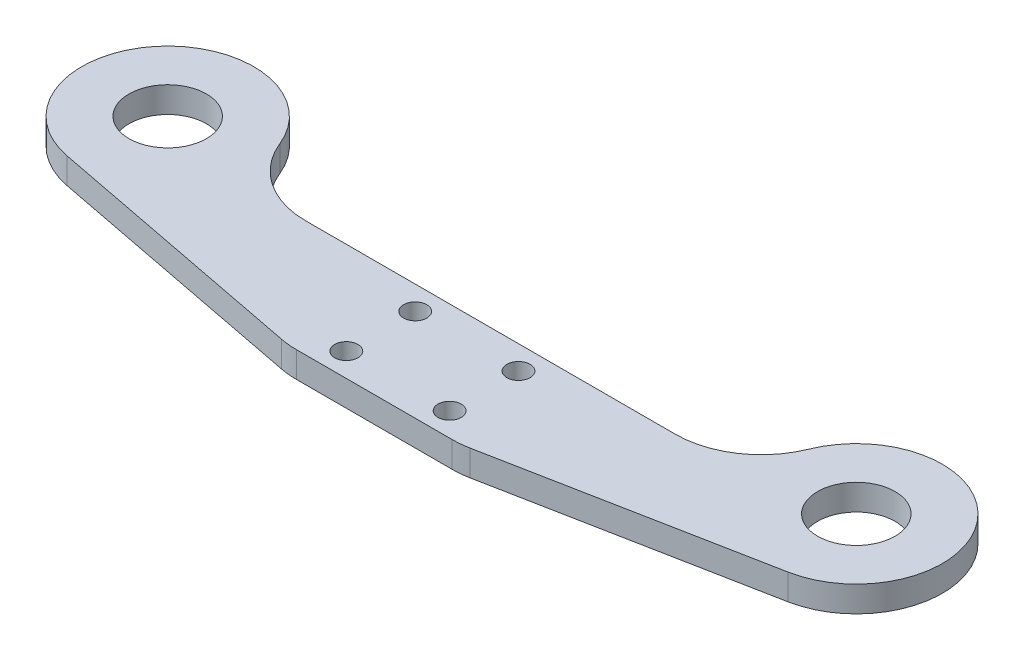
ISO-10303-21;
HEADER;
FILE_DESCRIPTION(('STEP AP214'),'2;1');
FILE_NAME('part.step','',(''),(''),'','','');
FILE_SCHEMA(('AUTOMOTIVE_DESIGN { 1 0 10303 214 1 1 1 1 }'));
ENDSEC;
DATA;
#1=APPLICATION_CONTEXT('core data for automotive mechanical design processes');
#2=APPLICATION_PROTOCOL_DEFINITION('international standard','automotive_design',2000,#1);
#3=PRODUCT_CONTEXT('',#1,'mechanical');
#4=PRODUCT('Part','Part','',(#3));
#5=PRODUCT_RELATED_PRODUCT_CATEGORY('part','',(#4));
#6=PRODUCT_DEFINITION_FORMATION('','',#4);
#7=PRODUCT_DEFINITION_CONTEXT('part definition',#1,'design');
#8=PRODUCT_DEFINITION('design','',#6,#7);
#9=PRODUCT_DEFINITION_SHAPE('','',#8);
#10=(LENGTH_UNIT() NAMED_UNIT(*) SI_UNIT(.MILLI.,.METRE.));
#11=(NAMED_UNIT(*) PLANE_ANGLE_UNIT() SI_UNIT($,.RADIAN.));
#12=(NAMED_UNIT(*) SI_UNIT($,.STERADIAN.) SOLID_ANGLE_UNIT());
#13=UNCERTAINTY_MEASURE_WITH_UNIT(LENGTH_MEASURE(1.E-05),#10,'distance_accuracy_value','');
#14=(GEOMETRIC_REPRESENTATION_CONTEXT(3) GLOBAL_UNCERTAINTY_ASSIGNED_CONTEXT((#13)) GLOBAL_UNIT_ASSIGNED_CONTEXT((#10,
#11,#12)) REPRESENTATION_CONTEXT('',''));
#15=CARTESIAN_POINT('',(0.,0.,0.));
#16=DIRECTION('',(0.,0.,1.));
#17=DIRECTION('',(1.,0.,0.));
#18=AXIS2_PLACEMENT_3D('',#15,#16,#17);
#19=CARTESIAN_POINT('',(-6.,3.,-4.));
#20=DIRECTION('',(0.,-1.,0.));
#21=DIRECTION('',(0.,0.,-1.));
#22=AXIS2_PLACEMENT_3D('',#19,#20,#21);
#23=CYLINDRICAL_SURFACE('',#22,1.35);
#24=CARTESIAN_POINT('',(-6.,3.,-4.));
#25=DIRECTION('',(0.,1.,0.));
#26=DIRECTION('',(0.,0.,1.));
#27=AXIS2_PLACEMENT_3D('',#24,#25,#26);
#28=CIRCLE('',#27,1.35);
#29=CARTESIAN_POINT('',(-6.,3.,-2.65));
#30=VERTEX_POINT('',#29);
#31=EDGE_CURVE('E192',#30,#30,#28,.T.);
#32=ORIENTED_EDGE('',*,*,#31,.T.);
#33=EDGE_LOOP('',(#32));
#34=FACE_BOUND('',#33,.T.);
#35=CARTESIAN_POINT('',(-6.,0.,-4.));
#36=DIRECTION('',(0.,1.,0.));
#37=DIRECTION('',(0.,0.,1.));
#38=AXIS2_PLACEMENT_3D('',#35,#36,#37);
#39=CIRCLE('',#38,1.35);
#40=CARTESIAN_POINT('',(-6.,0.,-2.65));
#41=VERTEX_POINT('',#40);
#42=EDGE_CURVE('E269',#41,#41,#39,.T.);
#43=ORIENTED_EDGE('',*,*,#42,.F.);
#44=EDGE_LOOP('',(#43));
#45=FACE_BOUND('',#44,.T.);
#46=ADVANCED_FACE('F84',(#34,#45),#23,.F.);
#47=CARTESIAN_POINT('',(-6.,3.,4.));
#48=DIRECTION('',(0.,-1.,0.));
#49=DIRECTION('',(0.,0.,-1.));
#50=AXIS2_PLACEMENT_3D('',#47,#48,#49);
#51=CYLINDRICAL_SURFACE('',#50,1.35);
#52=CARTESIAN_POINT('',(-6.,3.,4.));
#53=DIRECTION('',(0.,1.,0.));
#54=DIRECTION('',(0.,0.,1.));
#55=AXIS2_PLACEMENT_3D('',#52,#53,#54);
#56=CIRCLE('',#55,1.35);
#57=CARTESIAN_POINT('',(-6.,3.,5.35));
#58=VERTEX_POINT('',#57);
#59=EDGE_CURVE('E287',#58,#58,#56,.T.);
#60=ORIENTED_EDGE('',*,*,#59,.T.);
#61=EDGE_LOOP('',(#60));
#62=FACE_BOUND('',#61,.T.);
#63=CARTESIAN_POINT('',(-6.,0.,4.));
#64=DIRECTION('',(0.,1.,0.));
#65=DIRECTION('',(0.,0.,1.));
#66=AXIS2_PLACEMENT_3D('',#63,#64,#65);
#67=CIRCLE('',#66,1.35);
#68=CARTESIAN_POINT('',(-6.,0.,5.35));
#69=VERTEX_POINT('',#68);
#70=EDGE_CURVE('E267',#69,#69,#67,.T.);
#71=ORIENTED_EDGE('',*,*,#70,.F.);
#72=EDGE_LOOP('',(#71));
#73=FACE_BOUND('',#72,.T.);
#74=ADVANCED_FACE('F307',(#62,#73),#51,.F.);
#75=CARTESIAN_POINT('',(6.,3.,4.));
#76=DIRECTION('',(0.,-1.,0.));
#77=DIRECTION('',(0.,0.,-1.));
#78=AXIS2_PLACEMENT_3D('',#75,#76,#77);
#79=CYLINDRICAL_SURFACE('',#78,1.35);
#80=CARTESIAN_POINT('',(6.,3.,4.));
#81=DIRECTION('',(0.,1.,0.));
#82=DIRECTION('',(0.,0.,1.));
#83=AXIS2_PLACEMENT_3D('',#80,#81,#82);
#84=CIRCLE('',#83,1.35);
#85=CARTESIAN_POINT('',(6.,3.,5.35));
#86=VERTEX_POINT('',#85);
#87=EDGE_CURVE('E284',#86,#86,#84,.T.);
#88=ORIENTED_EDGE('',*,*,#87,.T.);
#89=EDGE_LOOP('',(#88));
#90=FACE_BOUND('',#89,.T.);
#91=CARTESIAN_POINT('',(6.,0.,4.));
#92=DIRECTION('',(0.,1.,0.));
#93=DIRECTION('',(0.,0.,1.));
#94=AXIS2_PLACEMENT_3D('',#91,#92,#93);
#95=CIRCLE('',#94,1.35);
#96=CARTESIAN_POINT('',(6.,0.,5.35));
#97=VERTEX_POINT('',#96);
#98=EDGE_CURVE('E264',#97,#97,#95,.T.);
#99=ORIENTED_EDGE('',*,*,#98,.F.);
#100=EDGE_LOOP('',(#99));
#101=FACE_BOUND('',#100,.T.);
#102=ADVANCED_FACE('F313',(#90,#101),#79,.F.);
#103=CARTESIAN_POINT('',(6.,3.,-4.));
#104=DIRECTION('',(0.,-1.,0.));
#105=DIRECTION('',(0.,0.,-1.));
#106=AXIS2_PLACEMENT_3D('',#103,#104,#105);
#107=CYLINDRICAL_SURFACE('',#106,1.35);
#108=CARTESIAN_POINT('',(6.,3.,-4.));
#109=DIRECTION('',(0.,1.,0.));
#110=DIRECTION('',(0.,0.,1.));
#111=AXIS2_PLACEMENT_3D('',#108,#109,#110);
#112=CIRCLE('',#111,1.35);
#113=CARTESIAN_POINT('',(6.,3.,-2.65));
#114=VERTEX_POINT('',#113);
#115=EDGE_CURVE('E281',#114,#114,#112,.T.);
#116=ORIENTED_EDGE('',*,*,#115,.T.);
#117=EDGE_LOOP('',(#116));
#118=FACE_BOUND('',#117,.T.);
#119=CARTESIAN_POINT('',(6.,0.,-4.));
#120=DIRECTION('',(0.,1.,0.));
#121=DIRECTION('',(0.,0.,1.));
#122=AXIS2_PLACEMENT_3D('',#119,#120,#121);
#123=CIRCLE('',#122,1.35);
#124=CARTESIAN_POINT('',(6.,0.,-2.65));
#125=VERTEX_POINT('',#124);
#126=EDGE_CURVE('E261',#125,#125,#123,.T.);
#127=ORIENTED_EDGE('',*,*,#126,.F.);
#128=EDGE_LOOP('',(#127));
#129=FACE_BOUND('',#128,.T.);
#130=ADVANCED_FACE('F322',(#118,#129),#107,.F.);
#131=CARTESIAN_POINT('',(40.,3.,-9.25000000000001));
#132=DIRECTION('',(0.,-1.,0.));
#133=DIRECTION('',(0.,0.,-1.));
#134=AXIS2_PLACEMENT_3D('',#131,#132,#133);
#135=CYLINDRICAL_SURFACE('',#134,4.5);
#136=CARTESIAN_POINT('',(40.,3.,-9.25000000000001));
#137=DIRECTION('',(0.,1.,0.));
#138=DIRECTION('',(0.,0.,1.));
#139=AXIS2_PLACEMENT_3D('',#136,#137,#138);
#140=CIRCLE('',#139,4.5);
#141=CARTESIAN_POINT('',(40.,3.,-4.75000000000001));
#142=VERTEX_POINT('',#141);
#143=EDGE_CURVE('E239',#142,#142,#140,.F.);
#144=ORIENTED_EDGE('',*,*,#143,.F.);
#145=EDGE_LOOP('',(#144));
#146=FACE_BOUND('',#145,.T.);
#147=CARTESIAN_POINT('',(40.,0.,-9.25000000000001));
#148=DIRECTION('',(0.,1.,0.));
#149=DIRECTION('',(0.,0.,1.));
#150=AXIS2_PLACEMENT_3D('',#147,#148,#149);
#151=CIRCLE('',#150,4.5);
#152=CARTESIAN_POINT('',(40.,0.,-4.75000000000001));
#153=VERTEX_POINT('',#152);
#154=EDGE_CURVE('E253',#153,#153,#151,.F.);
#155=ORIENTED_EDGE('',*,*,#154,.T.);
#156=EDGE_LOOP('',(#155));
#157=FACE_BOUND('',#156,.T.);
#158=ADVANCED_FACE('F326',(#146,#157),#135,.F.);
#159=CARTESIAN_POINT('',(0.,3.,-6.75));
#160=DIRECTION('',(0.,0.,1.));
#161=DIRECTION('',(1.,0.,0.));
#162=AXIS2_PLACEMENT_3D('',#159,#160,#161);
#163=PLANE('',#162);
#164=DIRECTION('',(-1.,0.,0.));
#165=VECTOR('',#164,1.);
#166=CARTESIAN_POINT('',(0.,3.,-6.75));
#167=LINE('',#166,#165);
#168=CARTESIAN_POINT('',(21.4595037822608,3.,-6.75));
#169=VERTEX_POINT('',#168);
#170=CARTESIAN_POINT('',(-21.4595037822608,3.,-6.75));
#171=VERTEX_POINT('',#170);
#172=EDGE_CURVE('E168',#169,#171,#167,.T.);
#173=ORIENTED_EDGE('',*,*,#172,.F.);
#174=DIRECTION('',(0.,-1.,0.));
#175=VECTOR('',#174,1.);
#176=CARTESIAN_POINT('',(21.4595037822608,3.,-6.75));
#177=LINE('',#176,#175);
#178=CARTESIAN_POINT('',(21.4595037822608,0.,-6.75));
#179=VERTEX_POINT('',#178);
#180=EDGE_CURVE('E189',#169,#179,#177,.T.);
#181=ORIENTED_EDGE('',*,*,#180,.T.);
#182=DIRECTION('',(-1.,0.,0.));
#183=VECTOR('',#182,1.);
#184=CARTESIAN_POINT('',(0.,0.,-6.75));
#185=LINE('',#184,#183);
#186=CARTESIAN_POINT('',(-21.4595037822608,0.,-6.75));
#187=VERTEX_POINT('',#186);
#188=EDGE_CURVE('E255',#179,#187,#185,.T.);
#189=ORIENTED_EDGE('',*,*,#188,.T.);
#190=DIRECTION('',(0.,1.,0.));
#191=VECTOR('',#190,1.);
#192=CARTESIAN_POINT('',(-21.4595037822608,3.,-6.75));
#193=LINE('',#192,#191);
#194=EDGE_CURVE('E186',#187,#171,#193,.T.);
#195=ORIENTED_EDGE('',*,*,#194,.T.);
#196=EDGE_LOOP('',(#173,#181,#189,#195));
#197=FACE_BOUND('',#196,.T.);
#198=ADVANCED_FACE('F297',(#197),#163,.F.);
#199=CARTESIAN_POINT('',(-1.62276662068648,3.,8.37349174268104));
#200=DIRECTION('',(-0.190258181571541,0.,0.98173409044664));
#201=DIRECTION('',(0.98173409044664,0.,0.190258181571541));
#202=AXIS2_PLACEMENT_3D('',#199,#200,#201);
#203=PLANE('',#202);
#204=DIRECTION('',(-0.98173409044664,0.,-0.190258181571541));
#205=VECTOR('',#204,1.);
#206=CARTESIAN_POINT('',(-1.62276662068648,0.,8.37349174268104));
#207=LINE('',#206,#205);
#208=CARTESIAN_POINT('',(-10.9425227316601,0.,6.56734090446639));
#209=VERTEX_POINT('',#208);
#210=CARTESIAN_POINT('',(-41.9025818157154,0.,0.567340904466406));
#211=VERTEX_POINT('',#210);
#212=EDGE_CURVE('E251',#209,#211,#207,.T.);
#213=ORIENTED_EDGE('',*,*,#212,.F.);
#214=DIRECTION('',(0.,-1.,0.));
#215=VECTOR('',#214,1.);
#216=CARTESIAN_POINT('',(-10.9425227316601,3.,6.5673409044664));
#217=LINE('',#216,#215);
#218=CARTESIAN_POINT('',(-10.9425227316601,3.,6.56734090446639));
#219=VERTEX_POINT('',#218);
#220=EDGE_CURVE('E12',#209,#219,#217,.F.);
#221=ORIENTED_EDGE('',*,*,#220,.T.);
#222=DIRECTION('',(-0.98173409044664,0.,-0.190258181571541));
#223=VECTOR('',#222,1.);
#224=CARTESIAN_POINT('',(-1.62276662068648,3.,8.37349174268104));
#225=LINE('',#224,#223);
#226=CARTESIAN_POINT('',(-41.9025818157154,3.,0.567340904466406));
#227=VERTEX_POINT('',#226);
#228=EDGE_CURVE('E160',#219,#227,#225,.T.);
#229=ORIENTED_EDGE('',*,*,#228,.T.);
#230=DIRECTION('',(0.,-1.,0.));
#231=VECTOR('',#230,1.);
#232=CARTESIAN_POINT('',(-41.9025818157154,3.,0.567340904466406));
#233=LINE('',#232,#231);
#234=EDGE_CURVE('E164',#227,#211,#233,.T.);
#235=ORIENTED_EDGE('',*,*,#234,.T.);
#236=EDGE_LOOP('',(#213,#221,#229,#235));
#237=FACE_BOUND('',#236,.T.);
#238=ADVANCED_FACE('F162',(#237),#203,.T.);
#239=CARTESIAN_POINT('',(0.,3.,6.75));
#240=DIRECTION('',(0.,0.,-1.));
#241=DIRECTION('',(-1.,0.,0.));
#242=AXIS2_PLACEMENT_3D('',#239,#240,#241);
#243=PLANE('',#242);
#244=DIRECTION('',(1.,0.,0.));
#245=VECTOR('',#244,1.);
#246=CARTESIAN_POINT('',(0.,0.,6.75));
#247=LINE('',#246,#245);
#248=CARTESIAN_POINT('',(-9.03994091594468,0.,6.75));
#249=VERTEX_POINT('',#248);
#250=CARTESIAN_POINT('',(9.03994091594468,0.,6.75));
#251=VERTEX_POINT('',#250);
#252=EDGE_CURVE('E246',#249,#251,#247,.T.);
#253=ORIENTED_EDGE('',*,*,#252,.T.);
#254=DIRECTION('',(0.,-1.,0.));
#255=VECTOR('',#254,1.);
#256=CARTESIAN_POINT('',(9.03994091594468,3.,6.75));
#257=LINE('',#256,#255);
#258=CARTESIAN_POINT('',(9.03994091594468,3.,6.75));
#259=VERTEX_POINT('',#258);
#260=EDGE_CURVE('E105',#251,#259,#257,.F.);
#261=ORIENTED_EDGE('',*,*,#260,.T.);
#262=DIRECTION('',(1.,0.,0.));
#263=VECTOR('',#262,1.);
#264=CARTESIAN_POINT('',(0.,3.,6.75));
#265=LINE('',#264,#263);
#266=CARTESIAN_POINT('',(-9.03994091594468,3.,6.75));
#267=VERTEX_POINT('',#266);
#268=EDGE_CURVE('E167',#267,#259,#265,.T.);
#269=ORIENTED_EDGE('',*,*,#268,.F.);
#270=DIRECTION('',(0.,-1.,0.));
#271=VECTOR('',#270,1.);
#272=CARTESIAN_POINT('',(-9.03994091594468,0.,6.75));
#273=LINE('',#272,#271);
#274=EDGE_CURVE('E223',#267,#249,#273,.T.);
#275=ORIENTED_EDGE('',*,*,#274,.T.);
#276=EDGE_LOOP('',(#253,#261,#269,#275));
#277=FACE_BOUND('',#276,.T.);
#278=ADVANCED_FACE('F249',(#277),#243,.F.);
#279=CARTESIAN_POINT('',(1.62276662068648,3.,8.37349174268104));
#280=DIRECTION('',(-0.190258181571541,0.,-0.98173409044664));
#281=DIRECTION('',(-0.98173409044664,0.,0.190258181571541));
#282=AXIS2_PLACEMENT_3D('',#279,#280,#281);
#283=PLANE('',#282);
#284=DIRECTION('',(0.98173409044664,0.,-0.190258181571541));
#285=VECTOR('',#284,1.);
#286=CARTESIAN_POINT('',(1.62276662068648,3.,8.37349174268104));
#287=LINE('',#286,#285);
#288=CARTESIAN_POINT('',(10.9425227316601,3.,6.56734090446639));
#289=VERTEX_POINT('',#288);
#290=CARTESIAN_POINT('',(41.9025818157154,3.,0.567340904466411));
#291=VERTEX_POINT('',#290);
#292=EDGE_CURVE('E231',#289,#291,#287,.T.);
#293=ORIENTED_EDGE('',*,*,#292,.F.);
#294=DIRECTION('',(0.,-1.,0.));
#295=VECTOR('',#294,1.);
#296=CARTESIAN_POINT('',(10.9425227316601,3.,6.5673409044664));
#297=LINE('',#296,#295);
#298=CARTESIAN_POINT('',(10.9425227316601,0.,6.56734090446639));
#299=VERTEX_POINT('',#298);
#300=EDGE_CURVE('E216',#289,#299,#297,.T.);
#301=ORIENTED_EDGE('',*,*,#300,.T.);
#302=DIRECTION('',(0.98173409044664,0.,-0.190258181571541));
#303=VECTOR('',#302,1.);
#304=CARTESIAN_POINT('',(1.62276662068648,0.,8.37349174268104));
#305=LINE('',#304,#303);
#306=CARTESIAN_POINT('',(41.9025818157154,0.,0.567340904466411));
#307=VERTEX_POINT('',#306);
#308=EDGE_CURVE('E248',#299,#307,#305,.T.);
#309=ORIENTED_EDGE('',*,*,#308,.T.);
#310=DIRECTION('',(0.,-1.,0.));
#311=VECTOR('',#310,1.);
#312=CARTESIAN_POINT('',(41.9025818157154,3.,0.567340904466411));
#313=LINE('',#312,#311);
#314=EDGE_CURVE('E187',#291,#307,#313,.T.);
#315=ORIENTED_EDGE('',*,*,#314,.F.);
#316=EDGE_LOOP('',(#293,#301,#309,#315));
#317=FACE_BOUND('',#316,.T.);
#318=ADVANCED_FACE('F237',(#317),#283,.F.);
#319=CARTESIAN_POINT('',(40.,3.,-9.25000000000001));
#320=DIRECTION('',(0.,-1.,0.));
#321=DIRECTION('',(0.,0.,-1.));
#322=AXIS2_PLACEMENT_3D('',#319,#320,#321);
#323=CYLINDRICAL_SURFACE('',#322,10.);
#324=CARTESIAN_POINT('',(40.,0.,-9.25000000000001));
#325=DIRECTION('',(0.,1.,0.));
#326=DIRECTION('',(0.,0.,1.));
#327=AXIS2_PLACEMENT_3D('',#324,#325,#326);
#328=CIRCLE('',#327,10.);
#329=CARTESIAN_POINT('',(30.7297518911304,0.,-13.));
#330=VERTEX_POINT('',#329);
#331=EDGE_CURVE('E180',#330,#307,#328,.F.);
#332=ORIENTED_EDGE('',*,*,#331,.F.);
#333=DIRECTION('',(0.,-1.,0.));
#334=VECTOR('',#333,1.);
#335=CARTESIAN_POINT('',(30.7297518911304,3.,-13.));
#336=LINE('',#335,#334);
#337=CARTESIAN_POINT('',(30.7297518911304,3.,-13.));
#338=VERTEX_POINT('',#337);
#339=EDGE_CURVE('E205',#330,#338,#336,.F.);
#340=ORIENTED_EDGE('',*,*,#339,.T.);
#341=CARTESIAN_POINT('',(40.,3.,-9.25000000000001));
#342=DIRECTION('',(0.,1.,0.));
#343=DIRECTION('',(0.,0.,1.));
#344=AXIS2_PLACEMENT_3D('',#341,#342,#343);
#345=CIRCLE('',#344,10.);
#346=EDGE_CURVE('E271',#338,#291,#345,.F.);
#347=ORIENTED_EDGE('',*,*,#346,.T.);
#348=ORIENTED_EDGE('',*,*,#314,.T.);
#349=EDGE_LOOP('',(#332,#340,#347,#348));
#350=FACE_BOUND('',#349,.T.);
#351=ADVANCED_FACE('F333',(#350),#323,.T.);
#352=CARTESIAN_POINT('',(0.,0.,0.));
#353=DIRECTION('',(0.,1.,0.));
#354=DIRECTION('',(0.,0.,1.));
#355=AXIS2_PLACEMENT_3D('',#352,#353,#354);
#356=PLANE('',#355);
#357=ORIENTED_EDGE('',*,*,#308,.F.);
#358=CARTESIAN_POINT('',(9.03994091594468,0.,-3.25));
#359=DIRECTION('',(0.,1.,0.));
#360=DIRECTION('',(0.,0.,1.));
#361=AXIS2_PLACEMENT_3D('',#358,#359,#360);
#362=CIRCLE('',#361,10.);
#363=EDGE_CURVE('E221',#299,#251,#362,.F.);
#364=ORIENTED_EDGE('',*,*,#363,.T.);
#365=ORIENTED_EDGE('',*,*,#252,.F.);
#366=CARTESIAN_POINT('',(-9.03994091594468,0.,-3.25));
#367=DIRECTION('',(0.,1.,0.));
#368=DIRECTION('',(0.,0.,1.));
#369=AXIS2_PLACEMENT_3D('',#366,#367,#368);
#370=CIRCLE('',#369,10.);
#371=EDGE_CURVE('E219',#249,#209,#370,.F.);
#372=ORIENTED_EDGE('',*,*,#371,.T.);
#373=ORIENTED_EDGE('',*,*,#212,.T.);
#374=CARTESIAN_POINT('',(-40.,0.,-9.25));
#375=DIRECTION('',(0.,1.,0.));
#376=DIRECTION('',(0.,0.,1.));
#377=AXIS2_PLACEMENT_3D('',#374,#375,#376);
#378=CIRCLE('',#377,10.);
#379=CARTESIAN_POINT('',(-30.7297518911304,0.,-13.));
#380=VERTEX_POINT('',#379);
#381=EDGE_CURVE('E181',#380,#211,#378,.T.);
#382=ORIENTED_EDGE('',*,*,#381,.F.);
#383=CARTESIAN_POINT('',(-21.4595037822608,0.,-16.75));
#384=DIRECTION('',(0.,1.,0.));
#385=DIRECTION('',(0.,0.,1.));
#386=AXIS2_PLACEMENT_3D('',#383,#384,#385);
#387=CIRCLE('',#386,10.);
#388=EDGE_CURVE('E213',#380,#187,#387,.T.);
#389=ORIENTED_EDGE('',*,*,#388,.T.);
#390=ORIENTED_EDGE('',*,*,#188,.F.);
#391=CARTESIAN_POINT('',(21.4595037822608,0.,-16.75));
#392=DIRECTION('',(0.,1.,0.));
#393=DIRECTION('',(0.,0.,1.));
#394=AXIS2_PLACEMENT_3D('',#391,#392,#393);
#395=CIRCLE('',#394,10.);
#396=EDGE_CURVE('E209',#179,#330,#395,.T.);
#397=ORIENTED_EDGE('',*,*,#396,.T.);
#398=ORIENTED_EDGE('',*,*,#331,.T.);
#399=EDGE_LOOP('',(#357,#364,#365,#372,#373,#382,#389,#390,#397,#398));
#400=FACE_BOUND('',#399,.T.);
#401=ORIENTED_EDGE('',*,*,#154,.F.);
#402=EDGE_LOOP('',(#401));
#403=FACE_BOUND('',#402,.T.);
#404=ORIENTED_EDGE('',*,*,#126,.T.);
#405=EDGE_LOOP('',(#404));
#406=FACE_BOUND('',#405,.T.);
#407=ORIENTED_EDGE('',*,*,#98,.T.);
#408=EDGE_LOOP('',(#407));
#409=FACE_BOUND('',#408,.T.);
#410=ORIENTED_EDGE('',*,*,#70,.T.);
#411=EDGE_LOOP('',(#410));
#412=FACE_BOUND('',#411,.T.);
#413=ORIENTED_EDGE('',*,*,#42,.T.);
#414=EDGE_LOOP('',(#413));
#415=FACE_BOUND('',#414,.T.);
#416=CARTESIAN_POINT('',(-40.,0.,-9.25));
#417=DIRECTION('',(0.,1.,0.));
#418=DIRECTION('',(0.,0.,1.));
#419=AXIS2_PLACEMENT_3D('',#416,#417,#418);
#420=CIRCLE('',#419,4.5);
#421=CARTESIAN_POINT('',(-40.,0.,-4.75));
#422=VERTEX_POINT('',#421);
#423=EDGE_CURVE('E199',#422,#422,#420,.T.);
#424=ORIENTED_EDGE('',*,*,#423,.T.);
#425=EDGE_LOOP('',(#424));
#426=FACE_BOUND('',#425,.T.);
#427=ADVANCED_FACE('F244',(#400,#403,#406,#409,#412,#415,#426),#356,.F.);
#428=CARTESIAN_POINT('',(0.,3.,0.));
#429=DIRECTION('',(0.,1.,0.));
#430=DIRECTION('',(0.,0.,1.));
#431=AXIS2_PLACEMENT_3D('',#428,#429,#430);
#432=PLANE('',#431);
#433=ORIENTED_EDGE('',*,*,#268,.T.);
#434=CARTESIAN_POINT('',(9.03994091594468,3.,-3.25));
#435=DIRECTION('',(0.,1.,0.));
#436=DIRECTION('',(0.,0.,1.));
#437=AXIS2_PLACEMENT_3D('',#434,#435,#436);
#438=CIRCLE('',#437,10.);
#439=EDGE_CURVE('E92',#259,#289,#438,.T.);
#440=ORIENTED_EDGE('',*,*,#439,.T.);
#441=ORIENTED_EDGE('',*,*,#292,.T.);
#442=ORIENTED_EDGE('',*,*,#346,.F.);
#443=CARTESIAN_POINT('',(21.4595037822608,3.,-16.75));
#444=DIRECTION('',(0.,1.,0.));
#445=DIRECTION('',(0.,0.,1.));
#446=AXIS2_PLACEMENT_3D('',#443,#444,#445);
#447=CIRCLE('',#446,10.);
#448=EDGE_CURVE('E211',#338,#169,#447,.F.);
#449=ORIENTED_EDGE('',*,*,#448,.T.);
#450=ORIENTED_EDGE('',*,*,#172,.T.);
#451=CARTESIAN_POINT('',(-21.4595037822608,3.,-16.75));
#452=DIRECTION('',(0.,1.,0.));
#453=DIRECTION('',(0.,0.,1.));
#454=AXIS2_PLACEMENT_3D('',#451,#452,#453);
#455=CIRCLE('',#454,10.);
#456=CARTESIAN_POINT('',(-30.7297518911304,3.,-13.));
#457=VERTEX_POINT('',#456);
#458=EDGE_CURVE('E176',#171,#457,#455,.F.);
#459=ORIENTED_EDGE('',*,*,#458,.T.);
#460=CARTESIAN_POINT('',(-40.,3.,-9.25));
#461=DIRECTION('',(0.,1.,0.));
#462=DIRECTION('',(0.,0.,1.));
#463=AXIS2_PLACEMENT_3D('',#460,#461,#462);
#464=CIRCLE('',#463,10.);
#465=EDGE_CURVE('E171',#457,#227,#464,.T.);
#466=ORIENTED_EDGE('',*,*,#465,.T.);
#467=ORIENTED_EDGE('',*,*,#228,.F.);
#468=CARTESIAN_POINT('',(-9.03994091594468,3.,-3.25));
#469=DIRECTION('',(0.,1.,0.));
#470=DIRECTION('',(0.,0.,1.));
#471=AXIS2_PLACEMENT_3D('',#468,#469,#470);
#472=CIRCLE('',#471,10.);
#473=EDGE_CURVE('E227',#219,#267,#472,.T.);
#474=ORIENTED_EDGE('',*,*,#473,.T.);
#475=EDGE_LOOP('',(#433,#440,#441,#442,#449,#450,#459,#466,#467,#474));
#476=FACE_BOUND('',#475,.T.);
#477=ORIENTED_EDGE('',*,*,#143,.T.);
#478=EDGE_LOOP('',(#477));
#479=FACE_BOUND('',#478,.T.);
#480=ORIENTED_EDGE('',*,*,#115,.F.);
#481=EDGE_LOOP('',(#480));
#482=FACE_BOUND('',#481,.T.);
#483=ORIENTED_EDGE('',*,*,#87,.F.);
#484=EDGE_LOOP('',(#483));
#485=FACE_BOUND('',#484,.T.);
#486=ORIENTED_EDGE('',*,*,#59,.F.);
#487=EDGE_LOOP('',(#486));
#488=FACE_BOUND('',#487,.T.);
#489=ORIENTED_EDGE('',*,*,#31,.F.);
#490=EDGE_LOOP('',(#489));
#491=FACE_BOUND('',#490,.T.);
#492=CARTESIAN_POINT('',(-40.,3.,-9.25));
#493=DIRECTION('',(0.,1.,0.));
#494=DIRECTION('',(0.,0.,1.));
#495=AXIS2_PLACEMENT_3D('',#492,#493,#494);
#496=CIRCLE('',#495,4.5);
#497=CARTESIAN_POINT('',(-40.,3.,-4.75));
#498=VERTEX_POINT('',#497);
#499=EDGE_CURVE('E196',#498,#498,#496,.T.);
#500=ORIENTED_EDGE('',*,*,#499,.F.);
#501=EDGE_LOOP('',(#500));
#502=FACE_BOUND('',#501,.T.);
#503=ADVANCED_FACE('F172',(#476,#479,#482,#485,#488,#491,#502),#432,.T.);
#504=CARTESIAN_POINT('',(-40.,3.,-9.25));
#505=DIRECTION('',(0.,-1.,0.));
#506=DIRECTION('',(0.,0.,-1.));
#507=AXIS2_PLACEMENT_3D('',#504,#505,#506);
#508=CYLINDRICAL_SURFACE('',#507,4.5);
#509=ORIENTED_EDGE('',*,*,#499,.T.);
#510=EDGE_LOOP('',(#509));
#511=FACE_BOUND('',#510,.T.);
#512=ORIENTED_EDGE('',*,*,#423,.F.);
#513=EDGE_LOOP('',(#512));
#514=FACE_BOUND('',#513,.T.);
#515=ADVANCED_FACE('F342',(#511,#514),#508,.F.);
#516=CARTESIAN_POINT('',(-40.,3.,-9.25));
#517=DIRECTION('',(0.,-1.,0.));
#518=DIRECTION('',(0.,0.,-1.));
#519=AXIS2_PLACEMENT_3D('',#516,#517,#518);
#520=CYLINDRICAL_SURFACE('',#519,10.);
#521=ORIENTED_EDGE('',*,*,#465,.F.);
#522=DIRECTION('',(0.,-1.,0.));
#523=VECTOR('',#522,1.);
#524=CARTESIAN_POINT('',(-30.7297518911304,3.,-13.));
#525=LINE('',#524,#523);
#526=EDGE_CURVE('E207',#457,#380,#525,.T.);
#527=ORIENTED_EDGE('',*,*,#526,.T.);
#528=ORIENTED_EDGE('',*,*,#381,.T.);
#529=ORIENTED_EDGE('',*,*,#234,.F.);
#530=EDGE_LOOP('',(#521,#527,#528,#529));
#531=FACE_BOUND('',#530,.T.);
#532=ADVANCED_FACE('F184',(#531),#520,.T.);
#533=CARTESIAN_POINT('',(21.4595037822608,3.,-16.75));
#534=DIRECTION('',(0.,-1.,0.));
#535=DIRECTION('',(0.,0.,-1.));
#536=AXIS2_PLACEMENT_3D('',#533,#534,#535);
#537=CYLINDRICAL_SURFACE('',#536,10.);
#538=ORIENTED_EDGE('',*,*,#448,.F.);
#539=ORIENTED_EDGE('',*,*,#339,.F.);
#540=ORIENTED_EDGE('',*,*,#396,.F.);
#541=ORIENTED_EDGE('',*,*,#180,.F.);
#542=EDGE_LOOP('',(#538,#539,#540,#541));
#543=FACE_BOUND('',#542,.T.);
#544=ADVANCED_FACE('F346',(#543),#537,.F.);
#545=CARTESIAN_POINT('',(-21.4595037822608,3.,-16.75));
#546=DIRECTION('',(0.,-1.,0.));
#547=DIRECTION('',(0.,0.,-1.));
#548=AXIS2_PLACEMENT_3D('',#545,#546,#547);
#549=CYLINDRICAL_SURFACE('',#548,10.);
#550=ORIENTED_EDGE('',*,*,#458,.F.);
#551=ORIENTED_EDGE('',*,*,#194,.F.);
#552=ORIENTED_EDGE('',*,*,#388,.F.);
#553=ORIENTED_EDGE('',*,*,#526,.F.);
#554=EDGE_LOOP('',(#550,#551,#552,#553));
#555=FACE_BOUND('',#554,.T.);
#556=ADVANCED_FACE('F300',(#555),#549,.F.);
#557=CARTESIAN_POINT('',(9.03994091594468,3.,-3.25));
#558=DIRECTION('',(0.,-1.,0.));
#559=DIRECTION('',(0.,0.,-1.));
#560=AXIS2_PLACEMENT_3D('',#557,#558,#559);
#561=CYLINDRICAL_SURFACE('',#560,10.);
#562=ORIENTED_EDGE('',*,*,#439,.F.);
#563=ORIENTED_EDGE('',*,*,#260,.F.);
#564=ORIENTED_EDGE('',*,*,#363,.F.);
#565=ORIENTED_EDGE('',*,*,#300,.F.);
#566=EDGE_LOOP('',(#562,#563,#564,#565));
#567=FACE_BOUND('',#566,.T.);
#568=ADVANCED_FACE('F241',(#567),#561,.T.);
#569=CARTESIAN_POINT('',(-9.03994091594468,3.,-3.25));
#570=DIRECTION('',(0.,1.,0.));
#571=DIRECTION('',(0.,0.,1.));
#572=AXIS2_PLACEMENT_3D('',#569,#570,#571);
#573=CYLINDRICAL_SURFACE('',#572,10.);
#574=ORIENTED_EDGE('',*,*,#473,.F.);
#575=ORIENTED_EDGE('',*,*,#220,.F.);
#576=ORIENTED_EDGE('',*,*,#371,.F.);
#577=ORIENTED_EDGE('',*,*,#274,.F.);
#578=EDGE_LOOP('',(#574,#575,#576,#577));
#579=FACE_BOUND('',#578,.T.);
#580=ADVANCED_FACE('F86',(#579),#573,.T.);
#581=CLOSED_SHELL('',(#46,#74,#102,#130,#158,#198,#238,#278,#318,#351,#427,#503,#515,#532,#544,
#556,#568,#580));
#582=MANIFOLD_SOLID_BREP('B2',#581);
#583=ADVANCED_BREP_SHAPE_REPRESENTATION('',(#18,#582),#14);
#584=SHAPE_DEFINITION_REPRESENTATION(#9,#583);
ENDSEC;
END-ISO-10303-21;
